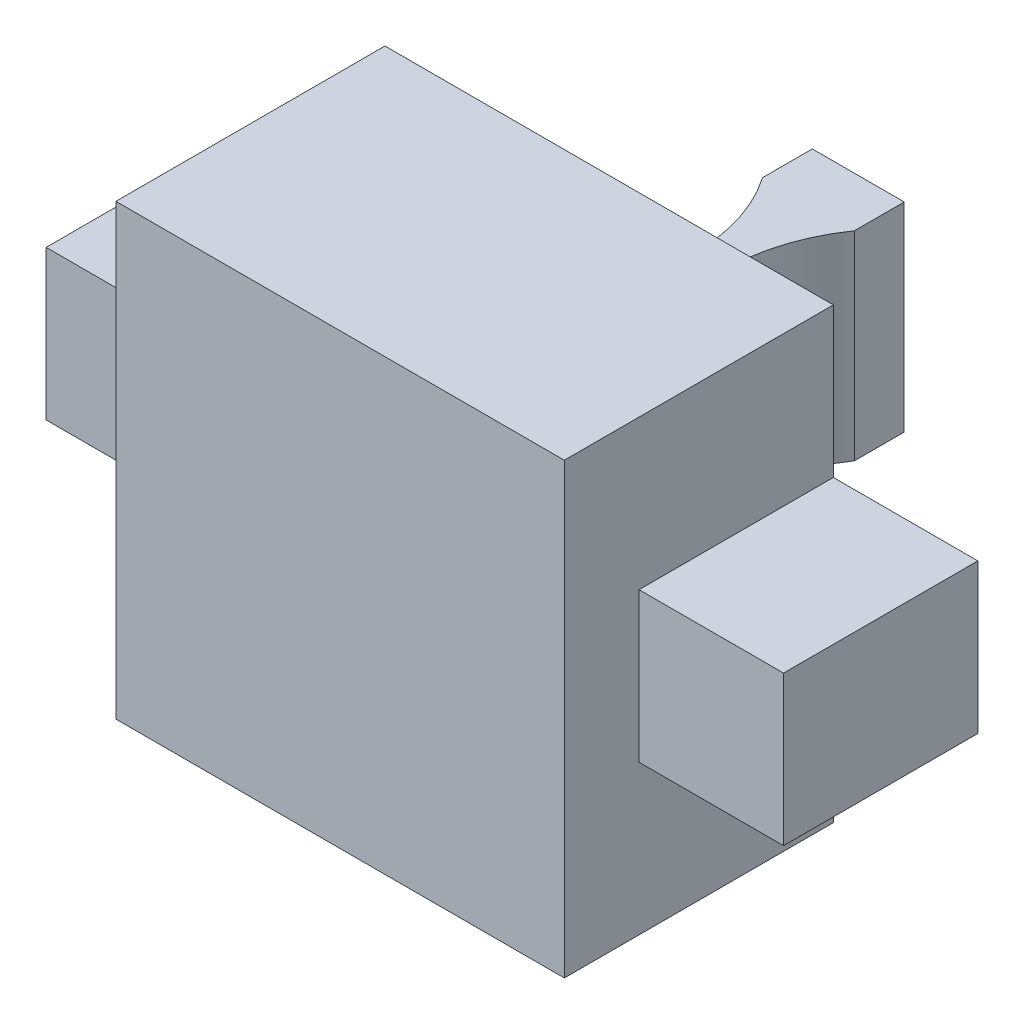
ISO-10303-21;
HEADER;
FILE_DESCRIPTION(('STEP AP214'),'2;1');
FILE_NAME('part.step','',(''),(''),'','','');
FILE_SCHEMA(('AUTOMOTIVE_DESIGN { 1 0 10303 214 1 1 1 1 }'));
ENDSEC;
DATA;
#1=APPLICATION_CONTEXT('core data for automotive mechanical design processes');
#2=APPLICATION_PROTOCOL_DEFINITION('international standard','automotive_design',2000,#1);
#3=PRODUCT_CONTEXT('',#1,'mechanical');
#4=PRODUCT('Part','Part','',(#3));
#5=PRODUCT_RELATED_PRODUCT_CATEGORY('part','',(#4));
#6=PRODUCT_DEFINITION_FORMATION('','',#4);
#7=PRODUCT_DEFINITION_CONTEXT('part definition',#1,'design');
#8=PRODUCT_DEFINITION('design','',#6,#7);
#9=PRODUCT_DEFINITION_SHAPE('','',#8);
#10=(LENGTH_UNIT() NAMED_UNIT(*) SI_UNIT(.MILLI.,.METRE.));
#11=(NAMED_UNIT(*) PLANE_ANGLE_UNIT() SI_UNIT($,.RADIAN.));
#12=(NAMED_UNIT(*) SI_UNIT($,.STERADIAN.) SOLID_ANGLE_UNIT());
#13=UNCERTAINTY_MEASURE_WITH_UNIT(LENGTH_MEASURE(1.E-05),#10,'distance_accuracy_value','');
#14=(GEOMETRIC_REPRESENTATION_CONTEXT(3) GLOBAL_UNCERTAINTY_ASSIGNED_CONTEXT((#13)) GLOBAL_UNIT_ASSIGNED_CONTEXT((#10,
#11,#12)) REPRESENTATION_CONTEXT('',''));
#15=CARTESIAN_POINT('',(0.,0.,0.));
#16=DIRECTION('',(0.,0.,1.));
#17=DIRECTION('',(1.,0.,0.));
#18=AXIS2_PLACEMENT_3D('',#15,#16,#17);
#19=CARTESIAN_POINT('',(9.,0.,5.4));
#20=DIRECTION('',(-1.,0.,0.));
#21=DIRECTION('',(0.,0.,1.));
#22=AXIS2_PLACEMENT_3D('',#19,#20,#21);
#23=PLANE('',#22);
#24=DIRECTION('',(0.,0.,-1.));
#25=VECTOR('',#24,1.);
#26=CARTESIAN_POINT('',(9.,3.,3.9));
#27=LINE('',#26,#25);
#28=CARTESIAN_POINT('',(9.,3.,3.9));
#29=VERTEX_POINT('',#28);
#30=CARTESIAN_POINT('',(9.,3.,0.));
#31=VERTEX_POINT('',#30);
#32=EDGE_CURVE('E268',#29,#31,#27,.T.);
#33=ORIENTED_EDGE('',*,*,#32,.F.);
#34=DIRECTION('',(0.,1.,0.));
#35=VECTOR('',#34,1.);
#36=CARTESIAN_POINT('',(9.,6.,3.9));
#37=LINE('',#36,#35);
#38=CARTESIAN_POINT('',(9.,6.,3.9));
#39=VERTEX_POINT('',#38);
#40=EDGE_CURVE('E250',#29,#39,#37,.T.);
#41=ORIENTED_EDGE('',*,*,#40,.T.);
#42=DIRECTION('',(0.,0.,-1.));
#43=VECTOR('',#42,1.);
#44=CARTESIAN_POINT('',(9.,6.,3.9));
#45=LINE('',#44,#43);
#46=CARTESIAN_POINT('',(9.,6.,0.));
#47=VERTEX_POINT('',#46);
#48=EDGE_CURVE('E264',#39,#47,#45,.T.);
#49=ORIENTED_EDGE('',*,*,#48,.T.);
#50=DIRECTION('',(0.,1.,0.));
#51=VECTOR('',#50,1.);
#52=CARTESIAN_POINT('',(9.,0.,0.));
#53=LINE('',#52,#51);
#54=CARTESIAN_POINT('',(9.,9.,0.));
#55=VERTEX_POINT('',#54);
#56=EDGE_CURVE('E339',#47,#55,#53,.T.);
#57=ORIENTED_EDGE('',*,*,#56,.T.);
#58=DIRECTION('',(0.,0.,-1.));
#59=VECTOR('',#58,1.);
#60=CARTESIAN_POINT('',(9.,9.,5.4));
#61=LINE('',#60,#59);
#62=CARTESIAN_POINT('',(9.,9.,5.4));
#63=VERTEX_POINT('',#62);
#64=EDGE_CURVE('E349',#63,#55,#61,.T.);
#65=ORIENTED_EDGE('',*,*,#64,.F.);
#66=DIRECTION('',(0.,1.,0.));
#67=VECTOR('',#66,1.);
#68=CARTESIAN_POINT('',(9.,0.,5.4));
#69=LINE('',#68,#67);
#70=CARTESIAN_POINT('',(9.,0.,5.4));
#71=VERTEX_POINT('',#70);
#72=EDGE_CURVE('E325',#71,#63,#69,.T.);
#73=ORIENTED_EDGE('',*,*,#72,.F.);
#74=DIRECTION('',(0.,0.,-1.));
#75=VECTOR('',#74,1.);
#76=CARTESIAN_POINT('',(9.,0.,5.4));
#77=LINE('',#76,#75);
#78=CARTESIAN_POINT('',(9.,0.,0.));
#79=VERTEX_POINT('',#78);
#80=EDGE_CURVE('E48',#71,#79,#77,.T.);
#81=ORIENTED_EDGE('',*,*,#80,.T.);
#82=EDGE_CURVE('E340',#79,#31,#53,.T.);
#83=ORIENTED_EDGE('',*,*,#82,.T.);
#84=EDGE_LOOP('',(#33,#41,#49,#57,#65,#73,#81,#83));
#85=FACE_BOUND('',#84,.T.);
#86=ADVANCED_FACE('F39',(#85),#23,.F.);
#87=CARTESIAN_POINT('',(0.,0.,5.4));
#88=DIRECTION('',(1.,0.,0.));
#89=DIRECTION('',(0.,0.,-1.));
#90=AXIS2_PLACEMENT_3D('',#87,#88,#89);
#91=PLANE('',#90);
#92=DIRECTION('',(0.,0.,-1.));
#93=VECTOR('',#92,1.);
#94=CARTESIAN_POINT('',(0.,6.,3.9));
#95=LINE('',#94,#93);
#96=CARTESIAN_POINT('',(0.,6.,3.9));
#97=VERTEX_POINT('',#96);
#98=CARTESIAN_POINT('',(0.,6.,0.));
#99=VERTEX_POINT('',#98);
#100=EDGE_CURVE('E304',#97,#99,#95,.T.);
#101=ORIENTED_EDGE('',*,*,#100,.F.);
#102=DIRECTION('',(0.,-1.,0.));
#103=VECTOR('',#102,1.);
#104=CARTESIAN_POINT('',(0.,6.,3.9));
#105=LINE('',#104,#103);
#106=CARTESIAN_POINT('',(0.,3.,3.9));
#107=VERTEX_POINT('',#106);
#108=EDGE_CURVE('E276',#97,#107,#105,.T.);
#109=ORIENTED_EDGE('',*,*,#108,.T.);
#110=DIRECTION('',(0.,0.,-1.));
#111=VECTOR('',#110,1.);
#112=CARTESIAN_POINT('',(0.,3.,3.9));
#113=LINE('',#112,#111);
#114=CARTESIAN_POINT('',(0.,3.,0.));
#115=VERTEX_POINT('',#114);
#116=EDGE_CURVE('E293',#107,#115,#113,.T.);
#117=ORIENTED_EDGE('',*,*,#116,.T.);
#118=DIRECTION('',(0.,-1.,0.));
#119=VECTOR('',#118,1.);
#120=CARTESIAN_POINT('',(0.,0.,0.));
#121=LINE('',#120,#119);
#122=CARTESIAN_POINT('',(0.,0.,0.));
#123=VERTEX_POINT('',#122);
#124=EDGE_CURVE('E307',#115,#123,#121,.T.);
#125=ORIENTED_EDGE('',*,*,#124,.T.);
#126=DIRECTION('',(0.,0.,-1.));
#127=VECTOR('',#126,1.);
#128=CARTESIAN_POINT('',(0.,0.,5.4));
#129=LINE('',#128,#127);
#130=CARTESIAN_POINT('',(0.,0.,5.4));
#131=VERTEX_POINT('',#130);
#132=EDGE_CURVE('E11',#131,#123,#129,.T.);
#133=ORIENTED_EDGE('',*,*,#132,.F.);
#134=DIRECTION('',(0.,-1.,0.));
#135=VECTOR('',#134,1.);
#136=CARTESIAN_POINT('',(0.,0.,5.4));
#137=LINE('',#136,#135);
#138=CARTESIAN_POINT('',(0.,9.,5.4));
#139=VERTEX_POINT('',#138);
#140=EDGE_CURVE('E317',#139,#131,#137,.T.);
#141=ORIENTED_EDGE('',*,*,#140,.F.);
#142=DIRECTION('',(0.,0.,-1.));
#143=VECTOR('',#142,1.);
#144=CARTESIAN_POINT('',(0.,9.,5.4));
#145=LINE('',#144,#143);
#146=CARTESIAN_POINT('',(0.,9.,0.));
#147=VERTEX_POINT('',#146);
#148=EDGE_CURVE('E331',#139,#147,#145,.T.);
#149=ORIENTED_EDGE('',*,*,#148,.T.);
#150=EDGE_CURVE('E332',#147,#99,#121,.T.);
#151=ORIENTED_EDGE('',*,*,#150,.T.);
#152=EDGE_LOOP('',(#101,#109,#117,#125,#133,#141,#149,#151));
#153=FACE_BOUND('',#152,.T.);
#154=ADVANCED_FACE('F41',(#153),#91,.F.);
#155=CARTESIAN_POINT('',(0.,0.,5.4));
#156=DIRECTION('',(0.,1.,0.));
#157=DIRECTION('',(0.,0.,1.));
#158=AXIS2_PLACEMENT_3D('',#155,#156,#157);
#159=PLANE('',#158);
#160=DIRECTION('',(1.,0.,0.));
#161=VECTOR('',#160,1.);
#162=CARTESIAN_POINT('',(0.,0.,0.));
#163=LINE('',#162,#161);
#164=EDGE_CURVE('E336',#123,#79,#163,.T.);
#165=ORIENTED_EDGE('',*,*,#164,.T.);
#166=ORIENTED_EDGE('',*,*,#80,.F.);
#167=DIRECTION('',(1.,0.,0.));
#168=VECTOR('',#167,1.);
#169=CARTESIAN_POINT('',(0.,0.,5.4));
#170=LINE('',#169,#168);
#171=EDGE_CURVE('E321',#131,#71,#170,.T.);
#172=ORIENTED_EDGE('',*,*,#171,.F.);
#173=ORIENTED_EDGE('',*,*,#132,.T.);
#174=EDGE_LOOP('',(#165,#166,#172,#173));
#175=FACE_BOUND('',#174,.T.);
#176=ADVANCED_FACE('F402',(#175),#159,.F.);
#177=CARTESIAN_POINT('',(0.,9.,5.4));
#178=DIRECTION('',(0.,-1.,0.));
#179=DIRECTION('',(0.,0.,-1.));
#180=AXIS2_PLACEMENT_3D('',#177,#178,#179);
#181=PLANE('',#180);
#182=DIRECTION('',(-1.,0.,0.));
#183=VECTOR('',#182,1.);
#184=CARTESIAN_POINT('',(0.,9.,0.));
#185=LINE('',#184,#183);
#186=EDGE_CURVE('E322',#55,#147,#185,.T.);
#187=ORIENTED_EDGE('',*,*,#186,.T.);
#188=ORIENTED_EDGE('',*,*,#148,.F.);
#189=DIRECTION('',(-1.,0.,0.));
#190=VECTOR('',#189,1.);
#191=CARTESIAN_POINT('',(0.,9.,5.4));
#192=LINE('',#191,#190);
#193=EDGE_CURVE('E328',#63,#139,#192,.T.);
#194=ORIENTED_EDGE('',*,*,#193,.F.);
#195=ORIENTED_EDGE('',*,*,#64,.T.);
#196=EDGE_LOOP('',(#187,#188,#194,#195));
#197=FACE_BOUND('',#196,.T.);
#198=ADVANCED_FACE('F399',(#197),#181,.F.);
#199=CARTESIAN_POINT('',(0.,0.,5.4));
#200=DIRECTION('',(0.,0.,-1.));
#201=DIRECTION('',(-1.,0.,0.));
#202=AXIS2_PLACEMENT_3D('',#199,#200,#201);
#203=PLANE('',#202);
#204=ORIENTED_EDGE('',*,*,#140,.T.);
#205=ORIENTED_EDGE('',*,*,#171,.T.);
#206=ORIENTED_EDGE('',*,*,#72,.T.);
#207=ORIENTED_EDGE('',*,*,#193,.T.);
#208=EDGE_LOOP('',(#204,#205,#206,#207));
#209=FACE_BOUND('',#208,.T.);
#210=ADVANCED_FACE('F401',(#209),#203,.F.);
#211=CARTESIAN_POINT('',(0.,0.,0.));
#212=DIRECTION('',(0.,0.,-1.));
#213=DIRECTION('',(-1.,0.,0.));
#214=AXIS2_PLACEMENT_3D('',#211,#212,#213);
#215=PLANE('',#214);
#216=DIRECTION('',(1.,0.,0.));
#217=VECTOR('',#216,1.);
#218=CARTESIAN_POINT('',(3.57776323074016,6.5,0.));
#219=LINE('',#218,#217);
#220=CARTESIAN_POINT('',(3.57776323074016,6.5,0.));
#221=VERTEX_POINT('',#220);
#222=CARTESIAN_POINT('',(5.42223676925983,6.5,0.));
#223=VERTEX_POINT('',#222);
#224=EDGE_CURVE('E168',#221,#223,#219,.T.);
#225=ORIENTED_EDGE('',*,*,#224,.F.);
#226=DIRECTION('',(0.,-1.,0.));
#227=VECTOR('',#226,1.);
#228=CARTESIAN_POINT('',(3.57776323074016,6.5,0.));
#229=LINE('',#228,#227);
#230=CARTESIAN_POINT('',(3.57776323074016,2.5,0.));
#231=VERTEX_POINT('',#230);
#232=EDGE_CURVE('E180',#221,#231,#229,.T.);
#233=ORIENTED_EDGE('',*,*,#232,.T.);
#234=DIRECTION('',(1.,0.,0.));
#235=VECTOR('',#234,1.);
#236=CARTESIAN_POINT('',(3.57776323074016,2.5,0.));
#237=LINE('',#236,#235);
#238=CARTESIAN_POINT('',(5.42223676925983,2.5,0.));
#239=VERTEX_POINT('',#238);
#240=EDGE_CURVE('E209',#231,#239,#237,.T.);
#241=ORIENTED_EDGE('',*,*,#240,.T.);
#242=DIRECTION('',(0.,-1.,0.));
#243=VECTOR('',#242,1.);
#244=CARTESIAN_POINT('',(5.42223676925983,6.5,0.));
#245=LINE('',#244,#243);
#246=EDGE_CURVE('E187',#223,#239,#245,.T.);
#247=ORIENTED_EDGE('',*,*,#246,.F.);
#248=EDGE_LOOP('',(#225,#233,#241,#247));
#249=FACE_BOUND('',#248,.T.);
#250=ORIENTED_EDGE('',*,*,#150,.F.);
#251=ORIENTED_EDGE('',*,*,#186,.F.);
#252=ORIENTED_EDGE('',*,*,#56,.F.);
#253=DIRECTION('',(1.,0.,0.));
#254=VECTOR('',#253,1.);
#255=CARTESIAN_POINT('',(9.,6.,0.));
#256=LINE('',#255,#254);
#257=CARTESIAN_POINT('',(11.9,6.,0.));
#258=VERTEX_POINT('',#257);
#259=EDGE_CURVE('E63',#47,#258,#256,.T.);
#260=ORIENTED_EDGE('',*,*,#259,.T.);
#261=DIRECTION('',(0.,-1.,0.));
#262=VECTOR('',#261,1.);
#263=CARTESIAN_POINT('',(11.9,6.,0.));
#264=LINE('',#263,#262);
#265=CARTESIAN_POINT('',(11.9,3.,0.));
#266=VERTEX_POINT('',#265);
#267=EDGE_CURVE('E257',#258,#266,#264,.T.);
#268=ORIENTED_EDGE('',*,*,#267,.T.);
#269=DIRECTION('',(-1.,0.,0.));
#270=VECTOR('',#269,1.);
#271=CARTESIAN_POINT('',(9.,3.,0.));
#272=LINE('',#271,#270);
#273=EDGE_CURVE('E243',#266,#31,#272,.T.);
#274=ORIENTED_EDGE('',*,*,#273,.T.);
#275=ORIENTED_EDGE('',*,*,#82,.F.);
#276=ORIENTED_EDGE('',*,*,#164,.F.);
#277=ORIENTED_EDGE('',*,*,#124,.F.);
#278=DIRECTION('',(-1.,0.,0.));
#279=VECTOR('',#278,1.);
#280=CARTESIAN_POINT('',(0.,3.,0.));
#281=LINE('',#280,#279);
#282=CARTESIAN_POINT('',(-2.9,3.,0.));
#283=VERTEX_POINT('',#282);
#284=EDGE_CURVE('E267',#115,#283,#281,.T.);
#285=ORIENTED_EDGE('',*,*,#284,.T.);
#286=DIRECTION('',(0.,1.,0.));
#287=VECTOR('',#286,1.);
#288=CARTESIAN_POINT('',(-2.9,6.,0.));
#289=LINE('',#288,#287);
#290=CARTESIAN_POINT('',(-2.9,6.,0.));
#291=VERTEX_POINT('',#290);
#292=EDGE_CURVE('E297',#283,#291,#289,.T.);
#293=ORIENTED_EDGE('',*,*,#292,.T.);
#294=DIRECTION('',(1.,0.,0.));
#295=VECTOR('',#294,1.);
#296=CARTESIAN_POINT('',(0.,6.,0.));
#297=LINE('',#296,#295);
#298=EDGE_CURVE('E281',#291,#99,#297,.T.);
#299=ORIENTED_EDGE('',*,*,#298,.T.);
#300=EDGE_LOOP('',(#250,#251,#252,#260,#268,#274,#275,#276,#277,#285,#293,#299));
#301=FACE_BOUND('',#300,.T.);
#302=ADVANCED_FACE('F190',(#249,#301),#215,.T.);
#303=CARTESIAN_POINT('',(0.,6.,3.9));
#304=DIRECTION('',(0.,1.,0.));
#305=DIRECTION('',(-1.,0.,0.));
#306=AXIS2_PLACEMENT_3D('',#303,#304,#305);
#307=PLANE('',#306);
#308=ORIENTED_EDGE('',*,*,#298,.F.);
#309=DIRECTION('',(0.,0.,-1.));
#310=VECTOR('',#309,1.);
#311=CARTESIAN_POINT('',(-2.9,6.,3.9));
#312=LINE('',#311,#310);
#313=CARTESIAN_POINT('',(-2.9,6.,3.9));
#314=VERTEX_POINT('',#313);
#315=EDGE_CURVE('E308',#314,#291,#312,.T.);
#316=ORIENTED_EDGE('',*,*,#315,.F.);
#317=DIRECTION('',(1.,0.,0.));
#318=VECTOR('',#317,1.);
#319=CARTESIAN_POINT('',(0.,6.,3.9));
#320=LINE('',#319,#318);
#321=EDGE_CURVE('E289',#314,#97,#320,.T.);
#322=ORIENTED_EDGE('',*,*,#321,.T.);
#323=ORIENTED_EDGE('',*,*,#100,.T.);
#324=EDGE_LOOP('',(#308,#316,#322,#323));
#325=FACE_BOUND('',#324,.T.);
#326=ADVANCED_FACE('F395',(#325),#307,.T.);
#327=CARTESIAN_POINT('',(-2.9,6.,3.9));
#328=DIRECTION('',(-1.,0.,0.));
#329=DIRECTION('',(0.,-1.,0.));
#330=AXIS2_PLACEMENT_3D('',#327,#328,#329);
#331=PLANE('',#330);
#332=ORIENTED_EDGE('',*,*,#292,.F.);
#333=DIRECTION('',(0.,0.,-1.));
#334=VECTOR('',#333,1.);
#335=CARTESIAN_POINT('',(-2.9,3.,3.9));
#336=LINE('',#335,#334);
#337=CARTESIAN_POINT('',(-2.9,3.,3.9));
#338=VERTEX_POINT('',#337);
#339=EDGE_CURVE('E311',#338,#283,#336,.T.);
#340=ORIENTED_EDGE('',*,*,#339,.F.);
#341=DIRECTION('',(0.,1.,0.));
#342=VECTOR('',#341,1.);
#343=CARTESIAN_POINT('',(-2.9,6.,3.9));
#344=LINE('',#343,#342);
#345=EDGE_CURVE('E285',#338,#314,#344,.T.);
#346=ORIENTED_EDGE('',*,*,#345,.T.);
#347=ORIENTED_EDGE('',*,*,#315,.T.);
#348=EDGE_LOOP('',(#332,#340,#346,#347));
#349=FACE_BOUND('',#348,.T.);
#350=ADVANCED_FACE('F392',(#349),#331,.T.);
#351=CARTESIAN_POINT('',(0.,3.,3.9));
#352=DIRECTION('',(0.,-1.,0.));
#353=DIRECTION('',(0.,0.,-1.));
#354=AXIS2_PLACEMENT_3D('',#351,#352,#353);
#355=PLANE('',#354);
#356=ORIENTED_EDGE('',*,*,#284,.F.);
#357=ORIENTED_EDGE('',*,*,#116,.F.);
#358=DIRECTION('',(-1.,0.,0.));
#359=VECTOR('',#358,1.);
#360=CARTESIAN_POINT('',(0.,3.,3.9));
#361=LINE('',#360,#359);
#362=EDGE_CURVE('E280',#107,#338,#361,.T.);
#363=ORIENTED_EDGE('',*,*,#362,.T.);
#364=ORIENTED_EDGE('',*,*,#339,.T.);
#365=EDGE_LOOP('',(#356,#357,#363,#364));
#366=FACE_BOUND('',#365,.T.);
#367=ADVANCED_FACE('F388',(#366),#355,.T.);
#368=CARTESIAN_POINT('',(0.,0.,3.9));
#369=DIRECTION('',(0.,0.,-1.));
#370=DIRECTION('',(-1.,0.,0.));
#371=AXIS2_PLACEMENT_3D('',#368,#369,#370);
#372=PLANE('',#371);
#373=ORIENTED_EDGE('',*,*,#108,.F.);
#374=ORIENTED_EDGE('',*,*,#321,.F.);
#375=ORIENTED_EDGE('',*,*,#345,.F.);
#376=ORIENTED_EDGE('',*,*,#362,.F.);
#377=EDGE_LOOP('',(#373,#374,#375,#376));
#378=FACE_BOUND('',#377,.T.);
#379=ADVANCED_FACE('F420',(#378),#372,.F.);
#380=CARTESIAN_POINT('',(9.,6.,3.9));
#381=DIRECTION('',(0.,1.,0.));
#382=DIRECTION('',(-1.,0.,0.));
#383=AXIS2_PLACEMENT_3D('',#380,#381,#382);
#384=PLANE('',#383);
#385=ORIENTED_EDGE('',*,*,#259,.F.);
#386=ORIENTED_EDGE('',*,*,#48,.F.);
#387=DIRECTION('',(1.,0.,0.));
#388=VECTOR('',#387,1.);
#389=CARTESIAN_POINT('',(9.,6.,3.9));
#390=LINE('',#389,#388);
#391=CARTESIAN_POINT('',(11.9,6.,3.9));
#392=VERTEX_POINT('',#391);
#393=EDGE_CURVE('E238',#39,#392,#390,.T.);
#394=ORIENTED_EDGE('',*,*,#393,.T.);
#395=DIRECTION('',(0.,0.,-1.));
#396=VECTOR('',#395,1.);
#397=CARTESIAN_POINT('',(11.9,6.,3.9));
#398=LINE('',#397,#396);
#399=EDGE_CURVE('E254',#392,#258,#398,.T.);
#400=ORIENTED_EDGE('',*,*,#399,.T.);
#401=EDGE_LOOP('',(#385,#386,#394,#400));
#402=FACE_BOUND('',#401,.T.);
#403=ADVANCED_FACE('F375',(#402),#384,.T.);
#404=CARTESIAN_POINT('',(9.,3.,3.9));
#405=DIRECTION('',(0.,-1.,0.));
#406=DIRECTION('',(0.,0.,-1.));
#407=AXIS2_PLACEMENT_3D('',#404,#405,#406);
#408=PLANE('',#407);
#409=ORIENTED_EDGE('',*,*,#273,.F.);
#410=DIRECTION('',(0.,0.,-1.));
#411=VECTOR('',#410,1.);
#412=CARTESIAN_POINT('',(11.9,3.,3.9));
#413=LINE('',#412,#411);
#414=CARTESIAN_POINT('',(11.9,3.,3.9));
#415=VERTEX_POINT('',#414);
#416=EDGE_CURVE('E271',#415,#266,#413,.T.);
#417=ORIENTED_EDGE('',*,*,#416,.F.);
#418=DIRECTION('',(-1.,0.,0.));
#419=VECTOR('',#418,1.);
#420=CARTESIAN_POINT('',(9.,3.,3.9));
#421=LINE('',#420,#419);
#422=EDGE_CURVE('E247',#415,#29,#421,.T.);
#423=ORIENTED_EDGE('',*,*,#422,.T.);
#424=ORIENTED_EDGE('',*,*,#32,.T.);
#425=EDGE_LOOP('',(#409,#417,#423,#424));
#426=FACE_BOUND('',#425,.T.);
#427=ADVANCED_FACE('F367',(#426),#408,.T.);
#428=CARTESIAN_POINT('',(11.9,6.,3.9));
#429=DIRECTION('',(1.,0.,0.));
#430=DIRECTION('',(0.,0.,-1.));
#431=AXIS2_PLACEMENT_3D('',#428,#429,#430);
#432=PLANE('',#431);
#433=ORIENTED_EDGE('',*,*,#267,.F.);
#434=ORIENTED_EDGE('',*,*,#399,.F.);
#435=DIRECTION('',(0.,-1.,0.));
#436=VECTOR('',#435,1.);
#437=CARTESIAN_POINT('',(11.9,6.,3.9));
#438=LINE('',#437,#436);
#439=EDGE_CURVE('E242',#392,#415,#438,.T.);
#440=ORIENTED_EDGE('',*,*,#439,.T.);
#441=ORIENTED_EDGE('',*,*,#416,.T.);
#442=EDGE_LOOP('',(#433,#434,#440,#441));
#443=FACE_BOUND('',#442,.T.);
#444=ADVANCED_FACE('F377',(#443),#432,.T.);
#445=CARTESIAN_POINT('',(0.,0.,3.9));
#446=DIRECTION('',(0.,0.,-1.));
#447=DIRECTION('',(-1.,0.,0.));
#448=AXIS2_PLACEMENT_3D('',#445,#446,#447);
#449=PLANE('',#448);
#450=ORIENTED_EDGE('',*,*,#393,.F.);
#451=ORIENTED_EDGE('',*,*,#40,.F.);
#452=ORIENTED_EDGE('',*,*,#422,.F.);
#453=ORIENTED_EDGE('',*,*,#439,.F.);
#454=EDGE_LOOP('',(#450,#451,#452,#453));
#455=FACE_BOUND('',#454,.T.);
#456=ADVANCED_FACE('F373',(#455),#449,.F.);
#457=CARTESIAN_POINT('',(0.70548190747115,6.5,-2.));
#458=DIRECTION('',(0.,-1.,0.));
#459=DIRECTION('',(0.,0.,-1.));
#460=AXIS2_PLACEMENT_3D('',#457,#458,#459);
#461=CYLINDRICAL_SURFACE('',#460,3.5);
#462=CARTESIAN_POINT('',(0.70548190747115,2.5,-2.));
#463=DIRECTION('',(0.,-1.,0.));
#464=DIRECTION('',(0.,0.,1.));
#465=AXIS2_PLACEMENT_3D('',#462,#463,#464);
#466=CIRCLE('',#465,3.5);
#467=CARTESIAN_POINT('',(3.57776323074016,2.5,-4.));
#468=VERTEX_POINT('',#467);
#469=EDGE_CURVE('E183',#468,#231,#466,.T.);
#470=ORIENTED_EDGE('',*,*,#469,.T.);
#471=ORIENTED_EDGE('',*,*,#232,.F.);
#472=CARTESIAN_POINT('',(0.70548190747115,6.5,-2.));
#473=DIRECTION('',(0.,-1.,0.));
#474=DIRECTION('',(0.,0.,1.));
#475=AXIS2_PLACEMENT_3D('',#472,#473,#474);
#476=CIRCLE('',#475,3.5);
#477=CARTESIAN_POINT('',(3.57776323074016,6.5,-4.));
#478=VERTEX_POINT('',#477);
#479=EDGE_CURVE('E164',#478,#221,#476,.T.);
#480=ORIENTED_EDGE('',*,*,#479,.F.);
#481=DIRECTION('',(0.,-1.,0.));
#482=VECTOR('',#481,1.);
#483=CARTESIAN_POINT('',(3.57776323074016,6.5,-4.));
#484=LINE('',#483,#482);
#485=EDGE_CURVE('E206',#478,#468,#484,.T.);
#486=ORIENTED_EDGE('',*,*,#485,.T.);
#487=EDGE_LOOP('',(#470,#471,#480,#486));
#488=FACE_BOUND('',#487,.T.);
#489=ADVANCED_FACE('F181',(#488),#461,.F.);
#490=CARTESIAN_POINT('',(8.29451809252885,6.5,-2.));
#491=DIRECTION('',(0.,-1.,0.));
#492=DIRECTION('',(0.,0.,-1.));
#493=AXIS2_PLACEMENT_3D('',#490,#491,#492);
#494=CYLINDRICAL_SURFACE('',#493,3.5);
#495=CARTESIAN_POINT('',(8.29451809252885,2.5,-2.));
#496=DIRECTION('',(0.,-1.,0.));
#497=DIRECTION('',(0.,0.,-1.));
#498=AXIS2_PLACEMENT_3D('',#495,#496,#497);
#499=CIRCLE('',#498,3.5);
#500=CARTESIAN_POINT('',(5.42223676925983,2.5,-4.));
#501=VERTEX_POINT('',#500);
#502=EDGE_CURVE('E55',#239,#501,#499,.T.);
#503=ORIENTED_EDGE('',*,*,#502,.T.);
#504=DIRECTION('',(0.,-1.,0.));
#505=VECTOR('',#504,1.);
#506=CARTESIAN_POINT('',(5.42223676925983,6.5,-4.));
#507=LINE('',#506,#505);
#508=CARTESIAN_POINT('',(5.42223676925983,6.5,-4.));
#509=VERTEX_POINT('',#508);
#510=EDGE_CURVE('E232',#509,#501,#507,.T.);
#511=ORIENTED_EDGE('',*,*,#510,.F.);
#512=CARTESIAN_POINT('',(8.29451809252885,6.5,-2.));
#513=DIRECTION('',(0.,-1.,0.));
#514=DIRECTION('',(0.,0.,-1.));
#515=AXIS2_PLACEMENT_3D('',#512,#513,#514);
#516=CIRCLE('',#515,3.5);
#517=EDGE_CURVE('E193',#223,#509,#516,.T.);
#518=ORIENTED_EDGE('',*,*,#517,.F.);
#519=ORIENTED_EDGE('',*,*,#246,.T.);
#520=EDGE_LOOP('',(#503,#511,#518,#519));
#521=FACE_BOUND('',#520,.T.);
#522=ADVANCED_FACE('F438',(#521),#494,.F.);
#523=CARTESIAN_POINT('',(5.42223676925983,6.5,-4.));
#524=DIRECTION('',(-1.,0.,0.));
#525=DIRECTION('',(0.,0.,1.));
#526=AXIS2_PLACEMENT_3D('',#523,#524,#525);
#527=PLANE('',#526);
#528=DIRECTION('',(0.,0.,-1.));
#529=VECTOR('',#528,1.);
#530=CARTESIAN_POINT('',(5.42223676925983,2.5,-4.));
#531=LINE('',#530,#529);
#532=CARTESIAN_POINT('',(5.42223676925983,2.5,-5.));
#533=VERTEX_POINT('',#532);
#534=EDGE_CURVE('E214',#501,#533,#531,.T.);
#535=ORIENTED_EDGE('',*,*,#534,.T.);
#536=DIRECTION('',(0.,-1.,0.));
#537=VECTOR('',#536,1.);
#538=CARTESIAN_POINT('',(5.42223676925983,6.5,-5.));
#539=LINE('',#538,#537);
#540=CARTESIAN_POINT('',(5.42223676925983,6.5,-5.));
#541=VERTEX_POINT('',#540);
#542=EDGE_CURVE('E228',#541,#533,#539,.T.);
#543=ORIENTED_EDGE('',*,*,#542,.F.);
#544=DIRECTION('',(0.,0.,-1.));
#545=VECTOR('',#544,1.);
#546=CARTESIAN_POINT('',(5.42223676925983,6.5,-4.));
#547=LINE('',#546,#545);
#548=EDGE_CURVE('E196',#509,#541,#547,.T.);
#549=ORIENTED_EDGE('',*,*,#548,.F.);
#550=ORIENTED_EDGE('',*,*,#510,.T.);
#551=EDGE_LOOP('',(#535,#543,#549,#550));
#552=FACE_BOUND('',#551,.T.);
#553=ADVANCED_FACE('F441',(#552),#527,.F.);
#554=CARTESIAN_POINT('',(3.57776323074016,6.5,-5.));
#555=DIRECTION('',(0.,0.,1.));
#556=DIRECTION('',(1.,0.,0.));
#557=AXIS2_PLACEMENT_3D('',#554,#555,#556);
#558=PLANE('',#557);
#559=DIRECTION('',(-1.,0.,0.));
#560=VECTOR('',#559,1.);
#561=CARTESIAN_POINT('',(3.57776323074016,2.5,-5.));
#562=LINE('',#561,#560);
#563=CARTESIAN_POINT('',(3.57776323074016,2.5,-5.));
#564=VERTEX_POINT('',#563);
#565=EDGE_CURVE('E217',#533,#564,#562,.T.);
#566=ORIENTED_EDGE('',*,*,#565,.T.);
#567=DIRECTION('',(0.,-1.,0.));
#568=VECTOR('',#567,1.);
#569=CARTESIAN_POINT('',(3.57776323074016,6.5,-5.));
#570=LINE('',#569,#568);
#571=CARTESIAN_POINT('',(3.57776323074016,6.5,-5.));
#572=VERTEX_POINT('',#571);
#573=EDGE_CURVE('E224',#572,#564,#570,.T.);
#574=ORIENTED_EDGE('',*,*,#573,.F.);
#575=DIRECTION('',(-1.,0.,0.));
#576=VECTOR('',#575,1.);
#577=CARTESIAN_POINT('',(3.57776323074016,6.5,-5.));
#578=LINE('',#577,#576);
#579=EDGE_CURVE('E201',#541,#572,#578,.T.);
#580=ORIENTED_EDGE('',*,*,#579,.F.);
#581=ORIENTED_EDGE('',*,*,#542,.T.);
#582=EDGE_LOOP('',(#566,#574,#580,#581));
#583=FACE_BOUND('',#582,.T.);
#584=ADVANCED_FACE('F445',(#583),#558,.F.);
#585=CARTESIAN_POINT('',(3.57776323074016,6.5,-4.));
#586=DIRECTION('',(1.,0.,0.));
#587=DIRECTION('',(0.,0.,-1.));
#588=AXIS2_PLACEMENT_3D('',#585,#586,#587);
#589=PLANE('',#588);
#590=DIRECTION('',(0.,0.,1.));
#591=VECTOR('',#590,1.);
#592=CARTESIAN_POINT('',(3.57776323074016,2.5,-4.));
#593=LINE('',#592,#591);
#594=EDGE_CURVE('E176',#564,#468,#593,.T.);
#595=ORIENTED_EDGE('',*,*,#594,.T.);
#596=ORIENTED_EDGE('',*,*,#485,.F.);
#597=DIRECTION('',(0.,0.,1.));
#598=VECTOR('',#597,1.);
#599=CARTESIAN_POINT('',(3.57776323074016,6.5,-4.));
#600=LINE('',#599,#598);
#601=EDGE_CURVE('E171',#572,#478,#600,.T.);
#602=ORIENTED_EDGE('',*,*,#601,.F.);
#603=ORIENTED_EDGE('',*,*,#573,.T.);
#604=EDGE_LOOP('',(#595,#596,#602,#603));
#605=FACE_BOUND('',#604,.T.);
#606=ADVANCED_FACE('F449',(#605),#589,.F.);
#607=CARTESIAN_POINT('',(0.70548190747115,6.5,-2.));
#608=DIRECTION('',(0.,1.,0.));
#609=DIRECTION('',(0.,0.,1.));
#610=AXIS2_PLACEMENT_3D('',#607,#608,#609);
#611=PLANE('',#610);
#612=ORIENTED_EDGE('',*,*,#479,.T.);
#613=ORIENTED_EDGE('',*,*,#224,.T.);
#614=ORIENTED_EDGE('',*,*,#517,.T.);
#615=ORIENTED_EDGE('',*,*,#548,.T.);
#616=ORIENTED_EDGE('',*,*,#579,.T.);
#617=ORIENTED_EDGE('',*,*,#601,.T.);
#618=EDGE_LOOP('',(#612,#613,#614,#615,#616,#617));
#619=FACE_BOUND('',#618,.T.);
#620=ADVANCED_FACE('F166',(#619),#611,.T.);
#621=CARTESIAN_POINT('',(0.70548190747115,2.5,-2.));
#622=DIRECTION('',(0.,1.,0.));
#623=DIRECTION('',(0.,0.,1.));
#624=AXIS2_PLACEMENT_3D('',#621,#622,#623);
#625=PLANE('',#624);
#626=ORIENTED_EDGE('',*,*,#469,.F.);
#627=ORIENTED_EDGE('',*,*,#594,.F.);
#628=ORIENTED_EDGE('',*,*,#565,.F.);
#629=ORIENTED_EDGE('',*,*,#534,.F.);
#630=ORIENTED_EDGE('',*,*,#502,.F.);
#631=ORIENTED_EDGE('',*,*,#240,.F.);
#632=EDGE_LOOP('',(#626,#627,#628,#629,#630,#631));
#633=FACE_BOUND('',#632,.T.);
#634=ADVANCED_FACE('F454',(#633),#625,.F.);
#635=CLOSED_SHELL('',(#86,#154,#176,#198,#210,#302,#326,#350,#367,#379,#403,#427,#444,#456,#489,
#522,#553,#584,#606,#620,#634));
#636=MANIFOLD_SOLID_BREP('B2',#635);
#637=ADVANCED_BREP_SHAPE_REPRESENTATION('',(#18,#636),#14);
#638=SHAPE_DEFINITION_REPRESENTATION(#9,#637);
ENDSEC;
END-ISO-10303-21;
